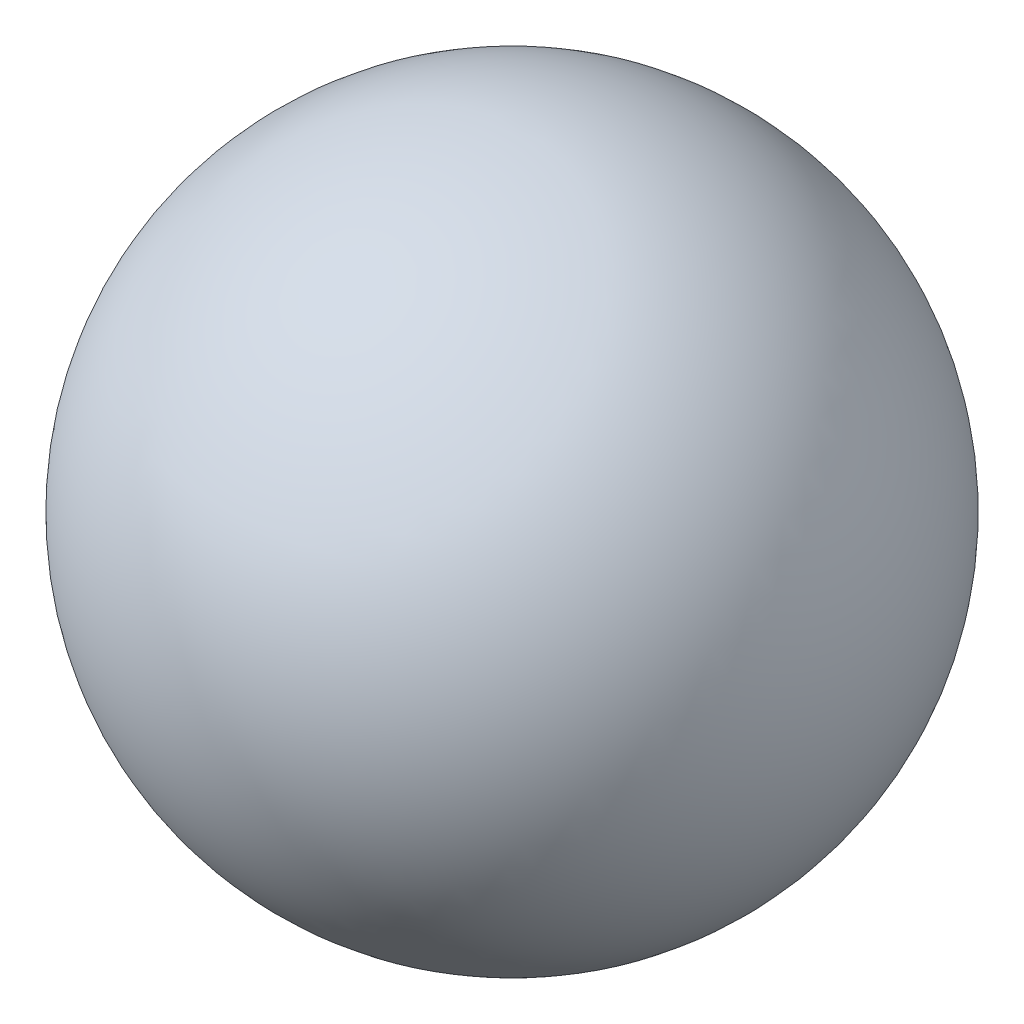
ISO-10303-21;
HEADER;
FILE_DESCRIPTION(('STEP AP214'),'2;1');
FILE_NAME('part.step','',(''),(''),'','','');
FILE_SCHEMA(('AUTOMOTIVE_DESIGN { 1 0 10303 214 1 1 1 1 }'));
ENDSEC;
DATA;
#1=APPLICATION_CONTEXT('core data for automotive mechanical design processes');
#2=APPLICATION_PROTOCOL_DEFINITION('international standard','automotive_design',2000,#1);
#3=PRODUCT_CONTEXT('',#1,'mechanical');
#4=PRODUCT('Part','Part','',(#3));
#5=PRODUCT_RELATED_PRODUCT_CATEGORY('part','',(#4));
#6=PRODUCT_DEFINITION_FORMATION('','',#4);
#7=PRODUCT_DEFINITION_CONTEXT('part definition',#1,'design');
#8=PRODUCT_DEFINITION('design','',#6,#7);
#9=PRODUCT_DEFINITION_SHAPE('','',#8);
#10=(LENGTH_UNIT() NAMED_UNIT(*) SI_UNIT(.MILLI.,.METRE.));
#11=(NAMED_UNIT(*) PLANE_ANGLE_UNIT() SI_UNIT($,.RADIAN.));
#12=(NAMED_UNIT(*) SI_UNIT($,.STERADIAN.) SOLID_ANGLE_UNIT());
#13=UNCERTAINTY_MEASURE_WITH_UNIT(LENGTH_MEASURE(1.E-05),#10,'distance_accuracy_value','');
#14=(GEOMETRIC_REPRESENTATION_CONTEXT(3) GLOBAL_UNCERTAINTY_ASSIGNED_CONTEXT((#13)) GLOBAL_UNIT_ASSIGNED_CONTEXT((#10,
#11,#12)) REPRESENTATION_CONTEXT('',''));
#15=CARTESIAN_POINT('',(0.,0.,0.));
#16=DIRECTION('',(0.,0.,1.));
#17=DIRECTION('',(1.,0.,0.));
#18=AXIS2_PLACEMENT_3D('',#15,#16,#17);
#19=CARTESIAN_POINT('',(0.,0.,0.));
#20=DIRECTION('',(0.,1.,0.));
#21=DIRECTION('',(1.,0.,0.));
#22=AXIS2_PLACEMENT_3D('',#19,#20,#21);
#23=SPHERICAL_SURFACE('',#22,21.);
#24=CARTESIAN_POINT('',(0.,21.,0.));
#25=VERTEX_POINT('',#24);
#26=VERTEX_LOOP('',#25);
#27=FACE_BOUND('',#26,.T.);
#28=ADVANCED_FACE('F39',(#27),#23,.T.);
#29=CLOSED_SHELL('',(#28));
#30=MANIFOLD_SOLID_BREP('B2',#29);
#31=ADVANCED_BREP_SHAPE_REPRESENTATION('',(#18,#30),#14);
#32=SHAPE_DEFINITION_REPRESENTATION(#9,#31);
ENDSEC;
END-ISO-10303-21;
